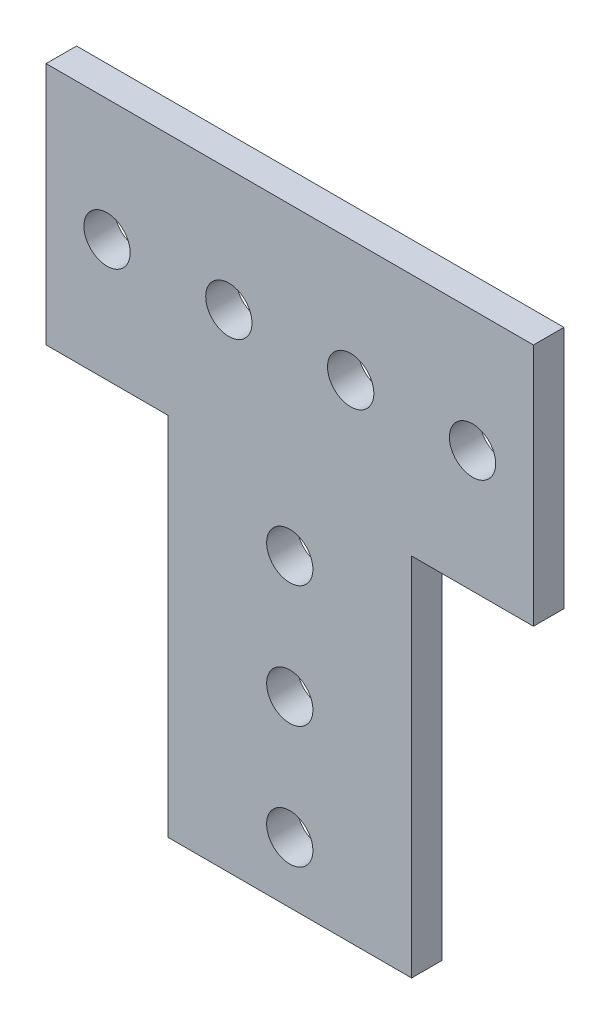
ISO-10303-21;
HEADER;
FILE_DESCRIPTION(('STEP AP214'),'2;1');
FILE_NAME('part.step','',(''),(''),'','','');
FILE_SCHEMA(('AUTOMOTIVE_DESIGN { 1 0 10303 214 1 1 1 1 }'));
ENDSEC;
DATA;
#1=APPLICATION_CONTEXT('core data for automotive mechanical design processes');
#2=APPLICATION_PROTOCOL_DEFINITION('international standard','automotive_design',2000,#1);
#3=PRODUCT_CONTEXT('',#1,'mechanical');
#4=PRODUCT('Part','Part','',(#3));
#5=PRODUCT_RELATED_PRODUCT_CATEGORY('part','',(#4));
#6=PRODUCT_DEFINITION_FORMATION('','',#4);
#7=PRODUCT_DEFINITION_CONTEXT('part definition',#1,'design');
#8=PRODUCT_DEFINITION('design','',#6,#7);
#9=PRODUCT_DEFINITION_SHAPE('','',#8);
#10=(LENGTH_UNIT() NAMED_UNIT(*) SI_UNIT(.MILLI.,.METRE.));
#11=(NAMED_UNIT(*) PLANE_ANGLE_UNIT() SI_UNIT($,.RADIAN.));
#12=(NAMED_UNIT(*) SI_UNIT($,.STERADIAN.) SOLID_ANGLE_UNIT());
#13=UNCERTAINTY_MEASURE_WITH_UNIT(LENGTH_MEASURE(1.E-05),#10,'distance_accuracy_value','');
#14=(GEOMETRIC_REPRESENTATION_CONTEXT(3) GLOBAL_UNCERTAINTY_ASSIGNED_CONTEXT((#13)) GLOBAL_UNIT_ASSIGNED_CONTEXT((#10,
#11,#12)) REPRESENTATION_CONTEXT('',''));
#15=CARTESIAN_POINT('',(0.,0.,0.));
#16=DIRECTION('',(0.,0.,1.));
#17=DIRECTION('',(1.,0.,0.));
#18=AXIS2_PLACEMENT_3D('',#15,#16,#17);
#19=CARTESIAN_POINT('',(25.4,0.,3.175));
#20=DIRECTION('',(0.,1.,0.));
#21=DIRECTION('',(-1.,0.,0.));
#22=AXIS2_PLACEMENT_3D('',#19,#20,#21);
#23=PLANE('',#22);
#24=DIRECTION('',(1.,0.,0.));
#25=VECTOR('',#24,1.);
#26=CARTESIAN_POINT('',(25.4,0.,0.));
#27=LINE('',#26,#25);
#28=CARTESIAN_POINT('',(0.,0.,0.));
#29=VERTEX_POINT('',#28);
#30=CARTESIAN_POINT('',(25.4,0.,0.));
#31=VERTEX_POINT('',#30);
#32=EDGE_CURVE('E140',#29,#31,#27,.T.);
#33=ORIENTED_EDGE('',*,*,#32,.T.);
#34=DIRECTION('',(0.,0.,-1.));
#35=VECTOR('',#34,1.);
#36=CARTESIAN_POINT('',(25.4,0.,3.175));
#37=LINE('',#36,#35);
#38=CARTESIAN_POINT('',(25.4,0.,3.175));
#39=VERTEX_POINT('',#38);
#40=EDGE_CURVE('E11',#39,#31,#37,.T.);
#41=ORIENTED_EDGE('',*,*,#40,.F.);
#42=DIRECTION('',(1.,0.,0.));
#43=VECTOR('',#42,1.);
#44=CARTESIAN_POINT('',(25.4,0.,3.175));
#45=LINE('',#44,#43);
#46=CARTESIAN_POINT('',(0.,0.,3.175));
#47=VERTEX_POINT('',#46);
#48=EDGE_CURVE('E163',#47,#39,#45,.T.);
#49=ORIENTED_EDGE('',*,*,#48,.F.);
#50=DIRECTION('',(0.,0.,-1.));
#51=VECTOR('',#50,1.);
#52=CARTESIAN_POINT('',(0.,0.,3.175));
#53=LINE('',#52,#51);
#54=EDGE_CURVE('E136',#47,#29,#53,.T.);
#55=ORIENTED_EDGE('',*,*,#54,.T.);
#56=EDGE_LOOP('',(#33,#41,#49,#55));
#57=FACE_BOUND('',#56,.T.);
#58=ADVANCED_FACE('F39',(#57),#23,.F.);
#59=CARTESIAN_POINT('',(25.4,38.1,3.175));
#60=DIRECTION('',(-1.,0.,0.));
#61=DIRECTION('',(0.,0.,1.));
#62=AXIS2_PLACEMENT_3D('',#59,#60,#61);
#63=PLANE('',#62);
#64=DIRECTION('',(0.,1.,0.));
#65=VECTOR('',#64,1.);
#66=CARTESIAN_POINT('',(25.4,38.1,0.));
#67=LINE('',#66,#65);
#68=CARTESIAN_POINT('',(25.4,38.1,0.));
#69=VERTEX_POINT('',#68);
#70=EDGE_CURVE('E144',#31,#69,#67,.T.);
#71=ORIENTED_EDGE('',*,*,#70,.T.);
#72=DIRECTION('',(0.,0.,-1.));
#73=VECTOR('',#72,1.);
#74=CARTESIAN_POINT('',(25.4,38.1,3.175));
#75=LINE('',#74,#73);
#76=CARTESIAN_POINT('',(25.4,38.1,3.175));
#77=VERTEX_POINT('',#76);
#78=EDGE_CURVE('E48',#77,#69,#75,.T.);
#79=ORIENTED_EDGE('',*,*,#78,.F.);
#80=DIRECTION('',(0.,1.,0.));
#81=VECTOR('',#80,1.);
#82=CARTESIAN_POINT('',(25.4,38.1,3.175));
#83=LINE('',#82,#81);
#84=EDGE_CURVE('E99',#39,#77,#83,.T.);
#85=ORIENTED_EDGE('',*,*,#84,.F.);
#86=ORIENTED_EDGE('',*,*,#40,.T.);
#87=EDGE_LOOP('',(#71,#79,#85,#86));
#88=FACE_BOUND('',#87,.T.);
#89=ADVANCED_FACE('F302',(#88),#63,.F.);
#90=CARTESIAN_POINT('',(38.1,38.1,3.175));
#91=DIRECTION('',(0.,1.,0.));
#92=DIRECTION('',(0.,0.,1.));
#93=AXIS2_PLACEMENT_3D('',#90,#91,#92);
#94=PLANE('',#93);
#95=DIRECTION('',(1.,0.,0.));
#96=VECTOR('',#95,1.);
#97=CARTESIAN_POINT('',(38.1,38.1,0.));
#98=LINE('',#97,#96);
#99=CARTESIAN_POINT('',(38.1,38.1,0.));
#100=VERTEX_POINT('',#99);
#101=EDGE_CURVE('E148',#69,#100,#98,.T.);
#102=ORIENTED_EDGE('',*,*,#101,.T.);
#103=DIRECTION('',(0.,0.,-1.));
#104=VECTOR('',#103,1.);
#105=CARTESIAN_POINT('',(38.1,38.1,3.175));
#106=LINE('',#105,#104);
#107=CARTESIAN_POINT('',(38.1,38.1,3.175));
#108=VERTEX_POINT('',#107);
#109=EDGE_CURVE('E174',#108,#100,#106,.T.);
#110=ORIENTED_EDGE('',*,*,#109,.F.);
#111=DIRECTION('',(1.,0.,0.));
#112=VECTOR('',#111,1.);
#113=CARTESIAN_POINT('',(38.1,38.1,3.175));
#114=LINE('',#113,#112);
#115=EDGE_CURVE('E184',#77,#108,#114,.T.);
#116=ORIENTED_EDGE('',*,*,#115,.F.);
#117=ORIENTED_EDGE('',*,*,#78,.T.);
#118=EDGE_LOOP('',(#102,#110,#116,#117));
#119=FACE_BOUND('',#118,.T.);
#120=ADVANCED_FACE('F182',(#119),#94,.F.);
#121=CARTESIAN_POINT('',(38.1,63.5,3.175));
#122=DIRECTION('',(-1.,0.,0.));
#123=DIRECTION('',(0.,0.,1.));
#124=AXIS2_PLACEMENT_3D('',#121,#122,#123);
#125=PLANE('',#124);
#126=DIRECTION('',(0.,1.,0.));
#127=VECTOR('',#126,1.);
#128=CARTESIAN_POINT('',(38.1,63.5,0.));
#129=LINE('',#128,#127);
#130=CARTESIAN_POINT('',(38.1,63.5,0.));
#131=VERTEX_POINT('',#130);
#132=EDGE_CURVE('E151',#100,#131,#129,.T.);
#133=ORIENTED_EDGE('',*,*,#132,.T.);
#134=DIRECTION('',(0.,0.,-1.));
#135=VECTOR('',#134,1.);
#136=CARTESIAN_POINT('',(38.1,63.5,3.175));
#137=LINE('',#136,#135);
#138=CARTESIAN_POINT('',(38.1,63.5,3.175));
#139=VERTEX_POINT('',#138);
#140=EDGE_CURVE('E170',#139,#131,#137,.T.);
#141=ORIENTED_EDGE('',*,*,#140,.F.);
#142=DIRECTION('',(0.,1.,0.));
#143=VECTOR('',#142,1.);
#144=CARTESIAN_POINT('',(38.1,63.5,3.175));
#145=LINE('',#144,#143);
#146=EDGE_CURVE('E197',#108,#139,#145,.T.);
#147=ORIENTED_EDGE('',*,*,#146,.F.);
#148=ORIENTED_EDGE('',*,*,#109,.T.);
#149=EDGE_LOOP('',(#133,#141,#147,#148));
#150=FACE_BOUND('',#149,.T.);
#151=ADVANCED_FACE('F192',(#150),#125,.F.);
#152=CARTESIAN_POINT('',(-12.7,63.5,3.175));
#153=DIRECTION('',(0.,-1.,0.));
#154=DIRECTION('',(0.,0.,-1.));
#155=AXIS2_PLACEMENT_3D('',#152,#153,#154);
#156=PLANE('',#155);
#157=DIRECTION('',(-1.,0.,0.));
#158=VECTOR('',#157,1.);
#159=CARTESIAN_POINT('',(-12.7,63.5,0.));
#160=LINE('',#159,#158);
#161=CARTESIAN_POINT('',(-12.7,63.5,0.));
#162=VERTEX_POINT('',#161);
#163=EDGE_CURVE('E154',#131,#162,#160,.T.);
#164=ORIENTED_EDGE('',*,*,#163,.T.);
#165=DIRECTION('',(0.,0.,-1.));
#166=VECTOR('',#165,1.);
#167=CARTESIAN_POINT('',(-12.7,63.5,3.175));
#168=LINE('',#167,#166);
#169=CARTESIAN_POINT('',(-12.7,63.5,3.175));
#170=VERTEX_POINT('',#169);
#171=EDGE_CURVE('E129',#170,#162,#168,.T.);
#172=ORIENTED_EDGE('',*,*,#171,.F.);
#173=DIRECTION('',(-1.,0.,0.));
#174=VECTOR('',#173,1.);
#175=CARTESIAN_POINT('',(-12.7,63.5,3.175));
#176=LINE('',#175,#174);
#177=EDGE_CURVE('E118',#139,#170,#176,.T.);
#178=ORIENTED_EDGE('',*,*,#177,.F.);
#179=ORIENTED_EDGE('',*,*,#140,.T.);
#180=EDGE_LOOP('',(#164,#172,#178,#179));
#181=FACE_BOUND('',#180,.T.);
#182=ADVANCED_FACE('F195',(#181),#156,.F.);
#183=CARTESIAN_POINT('',(-12.7,38.1,3.175));
#184=DIRECTION('',(1.,0.,0.));
#185=DIRECTION('',(0.,0.,-1.));
#186=AXIS2_PLACEMENT_3D('',#183,#184,#185);
#187=PLANE('',#186);
#188=DIRECTION('',(0.,-1.,0.));
#189=VECTOR('',#188,1.);
#190=CARTESIAN_POINT('',(-12.7,38.1,0.));
#191=LINE('',#190,#189);
#192=CARTESIAN_POINT('',(-12.7,38.1,0.));
#193=VERTEX_POINT('',#192);
#194=EDGE_CURVE('E127',#162,#193,#191,.T.);
#195=ORIENTED_EDGE('',*,*,#194,.T.);
#196=DIRECTION('',(0.,0.,-1.));
#197=VECTOR('',#196,1.);
#198=CARTESIAN_POINT('',(-12.7,38.1,3.175));
#199=LINE('',#198,#197);
#200=CARTESIAN_POINT('',(-12.7,38.1,3.175));
#201=VERTEX_POINT('',#200);
#202=EDGE_CURVE('E124',#201,#193,#199,.T.);
#203=ORIENTED_EDGE('',*,*,#202,.F.);
#204=DIRECTION('',(0.,-1.,0.));
#205=VECTOR('',#204,1.);
#206=CARTESIAN_POINT('',(-12.7,38.1,3.175));
#207=LINE('',#206,#205);
#208=EDGE_CURVE('E112',#170,#201,#207,.T.);
#209=ORIENTED_EDGE('',*,*,#208,.F.);
#210=ORIENTED_EDGE('',*,*,#171,.T.);
#211=EDGE_LOOP('',(#195,#203,#209,#210));
#212=FACE_BOUND('',#211,.T.);
#213=ADVANCED_FACE('F125',(#212),#187,.F.);
#214=CARTESIAN_POINT('',(0.,38.1,3.175));
#215=DIRECTION('',(0.,1.,0.));
#216=DIRECTION('',(0.,0.,1.));
#217=AXIS2_PLACEMENT_3D('',#214,#215,#216);
#218=PLANE('',#217);
#219=DIRECTION('',(1.,0.,0.));
#220=VECTOR('',#219,1.);
#221=CARTESIAN_POINT('',(0.,38.1,0.));
#222=LINE('',#221,#220);
#223=CARTESIAN_POINT('',(0.,38.1,0.));
#224=VERTEX_POINT('',#223);
#225=EDGE_CURVE('E85',#193,#224,#222,.T.);
#226=ORIENTED_EDGE('',*,*,#225,.T.);
#227=DIRECTION('',(0.,0.,-1.));
#228=VECTOR('',#227,1.);
#229=CARTESIAN_POINT('',(0.,38.1,3.175));
#230=LINE('',#229,#228);
#231=CARTESIAN_POINT('',(0.,38.1,3.175));
#232=VERTEX_POINT('',#231);
#233=EDGE_CURVE('E130',#232,#224,#230,.T.);
#234=ORIENTED_EDGE('',*,*,#233,.F.);
#235=DIRECTION('',(1.,0.,0.));
#236=VECTOR('',#235,1.);
#237=CARTESIAN_POINT('',(0.,38.1,3.175));
#238=LINE('',#237,#236);
#239=EDGE_CURVE('E116',#201,#232,#238,.T.);
#240=ORIENTED_EDGE('',*,*,#239,.F.);
#241=ORIENTED_EDGE('',*,*,#202,.T.);
#242=EDGE_LOOP('',(#226,#234,#240,#241));
#243=FACE_BOUND('',#242,.T.);
#244=ADVANCED_FACE('F132',(#243),#218,.F.);
#245=CARTESIAN_POINT('',(0.,0.,3.175));
#246=DIRECTION('',(1.,0.,0.));
#247=DIRECTION('',(0.,0.,-1.));
#248=AXIS2_PLACEMENT_3D('',#245,#246,#247);
#249=PLANE('',#248);
#250=DIRECTION('',(0.,-1.,0.));
#251=VECTOR('',#250,1.);
#252=CARTESIAN_POINT('',(0.,0.,0.));
#253=LINE('',#252,#251);
#254=EDGE_CURVE('E91',#224,#29,#253,.T.);
#255=ORIENTED_EDGE('',*,*,#254,.T.);
#256=ORIENTED_EDGE('',*,*,#54,.F.);
#257=DIRECTION('',(0.,-1.,0.));
#258=VECTOR('',#257,1.);
#259=CARTESIAN_POINT('',(0.,0.,3.175));
#260=LINE('',#259,#258);
#261=EDGE_CURVE('E56',#232,#47,#260,.T.);
#262=ORIENTED_EDGE('',*,*,#261,.F.);
#263=ORIENTED_EDGE('',*,*,#233,.T.);
#264=EDGE_LOOP('',(#255,#256,#262,#263));
#265=FACE_BOUND('',#264,.T.);
#266=ADVANCED_FACE('F309',(#265),#249,.F.);
#267=CARTESIAN_POINT('',(0.,0.,3.175));
#268=DIRECTION('',(0.,0.,-1.));
#269=DIRECTION('',(-1.,0.,0.));
#270=AXIS2_PLACEMENT_3D('',#267,#268,#269);
#271=PLANE('',#270);
#272=CARTESIAN_POINT('',(12.7,6.35,3.175));
#273=DIRECTION('',(0.,0.,-1.));
#274=DIRECTION('',(-1.,0.,0.));
#275=AXIS2_PLACEMENT_3D('',#272,#273,#274);
#276=CIRCLE('',#275,2.413);
#277=CARTESIAN_POINT('',(10.287,6.35,3.175));
#278=VERTEX_POINT('',#277);
#279=EDGE_CURVE('E251',#278,#278,#276,.T.);
#280=ORIENTED_EDGE('',*,*,#279,.T.);
#281=EDGE_LOOP('',(#280));
#282=FACE_BOUND('',#281,.T.);
#283=CARTESIAN_POINT('',(12.7,31.75,3.175));
#284=DIRECTION('',(0.,0.,-1.));
#285=DIRECTION('',(-1.,0.,0.));
#286=AXIS2_PLACEMENT_3D('',#283,#284,#285);
#287=CIRCLE('',#286,2.413);
#288=CARTESIAN_POINT('',(10.287,31.75,3.175));
#289=VERTEX_POINT('',#288);
#290=EDGE_CURVE('E243',#289,#289,#287,.T.);
#291=ORIENTED_EDGE('',*,*,#290,.T.);
#292=EDGE_LOOP('',(#291));
#293=FACE_BOUND('',#292,.T.);
#294=CARTESIAN_POINT('',(12.7,19.05,3.175));
#295=DIRECTION('',(0.,0.,-1.));
#296=DIRECTION('',(-1.,0.,0.));
#297=AXIS2_PLACEMENT_3D('',#294,#295,#296);
#298=CIRCLE('',#297,2.413);
#299=CARTESIAN_POINT('',(10.287,19.05,3.175));
#300=VERTEX_POINT('',#299);
#301=EDGE_CURVE('E220',#300,#300,#298,.T.);
#302=ORIENTED_EDGE('',*,*,#301,.T.);
#303=EDGE_LOOP('',(#302));
#304=FACE_BOUND('',#303,.T.);
#305=CARTESIAN_POINT('',(31.7499999999985,50.8000000002438,3.175));
#306=DIRECTION('',(0.,0.,-1.));
#307=DIRECTION('',(-1.,0.,0.));
#308=AXIS2_PLACEMENT_3D('',#305,#306,#307);
#309=CIRCLE('',#308,2.413);
#310=CARTESIAN_POINT('',(29.3369999999985,50.8000000002438,3.175));
#311=VERTEX_POINT('',#310);
#312=EDGE_CURVE('E219',#311,#311,#309,.T.);
#313=ORIENTED_EDGE('',*,*,#312,.T.);
#314=EDGE_LOOP('',(#313));
#315=FACE_BOUND('',#314,.T.);
#316=CARTESIAN_POINT('',(-6.35000000000149,50.8000000002438,3.175));
#317=DIRECTION('',(0.,0.,-1.));
#318=DIRECTION('',(-1.,0.,0.));
#319=AXIS2_PLACEMENT_3D('',#316,#317,#318);
#320=CIRCLE('',#319,2.413);
#321=CARTESIAN_POINT('',(-8.76300000000148,50.8000000002438,3.175));
#322=VERTEX_POINT('',#321);
#323=EDGE_CURVE('E228',#322,#322,#320,.T.);
#324=ORIENTED_EDGE('',*,*,#323,.T.);
#325=EDGE_LOOP('',(#324));
#326=FACE_BOUND('',#325,.T.);
#327=CARTESIAN_POINT('',(6.34999999999851,50.8000000002438,3.175));
#328=DIRECTION('',(0.,0.,-1.));
#329=DIRECTION('',(-1.,0.,0.));
#330=AXIS2_PLACEMENT_3D('',#327,#328,#329);
#331=CIRCLE('',#330,2.413);
#332=CARTESIAN_POINT('',(3.93699999999852,50.8000000002438,3.175));
#333=VERTEX_POINT('',#332);
#334=EDGE_CURVE('E211',#333,#333,#331,.T.);
#335=ORIENTED_EDGE('',*,*,#334,.T.);
#336=EDGE_LOOP('',(#335));
#337=FACE_BOUND('',#336,.T.);
#338=CARTESIAN_POINT('',(19.0499999999985,50.8000000002438,3.175));
#339=DIRECTION('',(0.,0.,-1.));
#340=DIRECTION('',(-1.,0.,0.));
#341=AXIS2_PLACEMENT_3D('',#338,#339,#340);
#342=CIRCLE('',#341,2.413);
#343=CARTESIAN_POINT('',(16.6369999999985,50.8000000002438,3.175));
#344=VERTEX_POINT('',#343);
#345=EDGE_CURVE('E145',#344,#344,#342,.T.);
#346=ORIENTED_EDGE('',*,*,#345,.T.);
#347=EDGE_LOOP('',(#346));
#348=FACE_BOUND('',#347,.T.);
#349=ORIENTED_EDGE('',*,*,#48,.T.);
#350=ORIENTED_EDGE('',*,*,#84,.T.);
#351=ORIENTED_EDGE('',*,*,#115,.T.);
#352=ORIENTED_EDGE('',*,*,#146,.T.);
#353=ORIENTED_EDGE('',*,*,#177,.T.);
#354=ORIENTED_EDGE('',*,*,#208,.T.);
#355=ORIENTED_EDGE('',*,*,#239,.T.);
#356=ORIENTED_EDGE('',*,*,#261,.T.);
#357=EDGE_LOOP('',(#349,#350,#351,#352,#353,#354,#355,#356));
#358=FACE_BOUND('',#357,.T.);
#359=ADVANCED_FACE('F114',(#282,#293,#304,#315,#326,#337,#348,#358),#271,.F.);
#360=CARTESIAN_POINT('',(0.,0.,0.));
#361=DIRECTION('',(0.,0.,-1.));
#362=DIRECTION('',(-1.,0.,0.));
#363=AXIS2_PLACEMENT_3D('',#360,#361,#362);
#364=PLANE('',#363);
#365=CARTESIAN_POINT('',(12.7,6.35,0.));
#366=DIRECTION('',(0.,0.,-1.));
#367=DIRECTION('',(-1.,0.,0.));
#368=AXIS2_PLACEMENT_3D('',#365,#366,#367);
#369=CIRCLE('',#368,2.413);
#370=CARTESIAN_POINT('',(10.287,6.35,0.));
#371=VERTEX_POINT('',#370);
#372=EDGE_CURVE('E247',#371,#371,#369,.T.);
#373=ORIENTED_EDGE('',*,*,#372,.F.);
#374=EDGE_LOOP('',(#373));
#375=FACE_BOUND('',#374,.T.);
#376=CARTESIAN_POINT('',(12.7,31.75,0.));
#377=DIRECTION('',(0.,0.,-1.));
#378=DIRECTION('',(-1.,0.,0.));
#379=AXIS2_PLACEMENT_3D('',#376,#377,#378);
#380=CIRCLE('',#379,2.413);
#381=CARTESIAN_POINT('',(10.287,31.75,0.));
#382=VERTEX_POINT('',#381);
#383=EDGE_CURVE('E255',#382,#382,#380,.T.);
#384=ORIENTED_EDGE('',*,*,#383,.F.);
#385=EDGE_LOOP('',(#384));
#386=FACE_BOUND('',#385,.T.);
#387=CARTESIAN_POINT('',(12.7,19.05,0.));
#388=DIRECTION('',(0.,0.,-1.));
#389=DIRECTION('',(-1.,0.,0.));
#390=AXIS2_PLACEMENT_3D('',#387,#388,#389);
#391=CIRCLE('',#390,2.413);
#392=CARTESIAN_POINT('',(10.287,19.05,0.));
#393=VERTEX_POINT('',#392);
#394=EDGE_CURVE('E239',#393,#393,#391,.T.);
#395=ORIENTED_EDGE('',*,*,#394,.F.);
#396=EDGE_LOOP('',(#395));
#397=FACE_BOUND('',#396,.T.);
#398=CARTESIAN_POINT('',(31.7499999999985,50.8000000002438,0.));
#399=DIRECTION('',(0.,0.,-1.));
#400=DIRECTION('',(-1.,0.,0.));
#401=AXIS2_PLACEMENT_3D('',#398,#399,#400);
#402=CIRCLE('',#401,2.413);
#403=CARTESIAN_POINT('',(29.3369999999985,50.8000000002438,0.));
#404=VERTEX_POINT('',#403);
#405=EDGE_CURVE('E215',#404,#404,#402,.T.);
#406=ORIENTED_EDGE('',*,*,#405,.F.);
#407=EDGE_LOOP('',(#406));
#408=FACE_BOUND('',#407,.T.);
#409=CARTESIAN_POINT('',(-6.35000000000149,50.8000000002438,0.));
#410=DIRECTION('',(0.,0.,-1.));
#411=DIRECTION('',(-1.,0.,0.));
#412=AXIS2_PLACEMENT_3D('',#409,#410,#411);
#413=CIRCLE('',#412,2.413);
#414=CARTESIAN_POINT('',(-8.76300000000148,50.8000000002438,0.));
#415=VERTEX_POINT('',#414);
#416=EDGE_CURVE('E224',#415,#415,#413,.T.);
#417=ORIENTED_EDGE('',*,*,#416,.F.);
#418=EDGE_LOOP('',(#417));
#419=FACE_BOUND('',#418,.T.);
#420=CARTESIAN_POINT('',(6.34999999999851,50.8000000002438,0.));
#421=DIRECTION('',(0.,0.,-1.));
#422=DIRECTION('',(-1.,0.,0.));
#423=AXIS2_PLACEMENT_3D('',#420,#421,#422);
#424=CIRCLE('',#423,2.413);
#425=CARTESIAN_POINT('',(3.93699999999852,50.8000000002438,0.));
#426=VERTEX_POINT('',#425);
#427=EDGE_CURVE('E232',#426,#426,#424,.T.);
#428=ORIENTED_EDGE('',*,*,#427,.F.);
#429=EDGE_LOOP('',(#428));
#430=FACE_BOUND('',#429,.T.);
#431=CARTESIAN_POINT('',(19.0499999999985,50.8000000002438,0.));
#432=DIRECTION('',(0.,0.,-1.));
#433=DIRECTION('',(-1.,0.,0.));
#434=AXIS2_PLACEMENT_3D('',#431,#432,#433);
#435=CIRCLE('',#434,2.413);
#436=CARTESIAN_POINT('',(16.6369999999985,50.8000000002438,0.));
#437=VERTEX_POINT('',#436);
#438=EDGE_CURVE('E207',#437,#437,#435,.T.);
#439=ORIENTED_EDGE('',*,*,#438,.F.);
#440=EDGE_LOOP('',(#439));
#441=FACE_BOUND('',#440,.T.);
#442=ORIENTED_EDGE('',*,*,#32,.F.);
#443=ORIENTED_EDGE('',*,*,#254,.F.);
#444=ORIENTED_EDGE('',*,*,#225,.F.);
#445=ORIENTED_EDGE('',*,*,#194,.F.);
#446=ORIENTED_EDGE('',*,*,#163,.F.);
#447=ORIENTED_EDGE('',*,*,#132,.F.);
#448=ORIENTED_EDGE('',*,*,#101,.F.);
#449=ORIENTED_EDGE('',*,*,#70,.F.);
#450=EDGE_LOOP('',(#442,#443,#444,#445,#446,#447,#448,#449));
#451=FACE_BOUND('',#450,.T.);
#452=ADVANCED_FACE('F188',(#375,#386,#397,#408,#419,#430,#441,#451),#364,.T.);
#453=CARTESIAN_POINT('',(19.0499999999985,50.8000000002438,3.175));
#454=DIRECTION('',(0.,0.,-1.));
#455=DIRECTION('',(-1.,0.,0.));
#456=AXIS2_PLACEMENT_3D('',#453,#454,#455);
#457=CYLINDRICAL_SURFACE('',#456,2.413);
#458=ORIENTED_EDGE('',*,*,#345,.F.);
#459=EDGE_LOOP('',(#458));
#460=FACE_BOUND('',#459,.T.);
#461=ORIENTED_EDGE('',*,*,#438,.T.);
#462=EDGE_LOOP('',(#461));
#463=FACE_BOUND('',#462,.T.);
#464=ADVANCED_FACE('F275',(#460,#463),#457,.F.);
#465=CARTESIAN_POINT('',(6.34999999999851,50.8000000002438,3.175));
#466=DIRECTION('',(0.,0.,-1.));
#467=DIRECTION('',(-1.,0.,0.));
#468=AXIS2_PLACEMENT_3D('',#465,#466,#467);
#469=CYLINDRICAL_SURFACE('',#468,2.413);
#470=ORIENTED_EDGE('',*,*,#334,.F.);
#471=EDGE_LOOP('',(#470));
#472=FACE_BOUND('',#471,.T.);
#473=ORIENTED_EDGE('',*,*,#427,.T.);
#474=EDGE_LOOP('',(#473));
#475=FACE_BOUND('',#474,.T.);
#476=ADVANCED_FACE('F289',(#472,#475),#469,.F.);
#477=CARTESIAN_POINT('',(-6.35000000000149,50.8000000002438,3.175));
#478=DIRECTION('',(0.,0.,-1.));
#479=DIRECTION('',(-1.,0.,0.));
#480=AXIS2_PLACEMENT_3D('',#477,#478,#479);
#481=CYLINDRICAL_SURFACE('',#480,2.413);
#482=ORIENTED_EDGE('',*,*,#323,.F.);
#483=EDGE_LOOP('',(#482));
#484=FACE_BOUND('',#483,.T.);
#485=ORIENTED_EDGE('',*,*,#416,.T.);
#486=EDGE_LOOP('',(#485));
#487=FACE_BOUND('',#486,.T.);
#488=ADVANCED_FACE('F295',(#484,#487),#481,.F.);
#489=CARTESIAN_POINT('',(31.7499999999985,50.8000000002438,3.175));
#490=DIRECTION('',(0.,0.,-1.));
#491=DIRECTION('',(-1.,0.,0.));
#492=AXIS2_PLACEMENT_3D('',#489,#490,#491);
#493=CYLINDRICAL_SURFACE('',#492,2.413);
#494=ORIENTED_EDGE('',*,*,#312,.F.);
#495=EDGE_LOOP('',(#494));
#496=FACE_BOUND('',#495,.T.);
#497=ORIENTED_EDGE('',*,*,#405,.T.);
#498=EDGE_LOOP('',(#497));
#499=FACE_BOUND('',#498,.T.);
#500=ADVANCED_FACE('F371',(#496,#499),#493,.F.);
#501=CARTESIAN_POINT('',(12.7,19.05,3.175));
#502=DIRECTION('',(0.,0.,-1.));
#503=DIRECTION('',(-1.,0.,0.));
#504=AXIS2_PLACEMENT_3D('',#501,#502,#503);
#505=CYLINDRICAL_SURFACE('',#504,2.413);
#506=ORIENTED_EDGE('',*,*,#301,.F.);
#507=EDGE_LOOP('',(#506));
#508=FACE_BOUND('',#507,.T.);
#509=ORIENTED_EDGE('',*,*,#394,.T.);
#510=EDGE_LOOP('',(#509));
#511=FACE_BOUND('',#510,.T.);
#512=ADVANCED_FACE('F269',(#508,#511),#505,.F.);
#513=CARTESIAN_POINT('',(12.7,31.75,3.175));
#514=DIRECTION('',(0.,0.,-1.));
#515=DIRECTION('',(-1.,0.,0.));
#516=AXIS2_PLACEMENT_3D('',#513,#514,#515);
#517=CYLINDRICAL_SURFACE('',#516,2.413);
#518=ORIENTED_EDGE('',*,*,#290,.F.);
#519=EDGE_LOOP('',(#518));
#520=FACE_BOUND('',#519,.T.);
#521=ORIENTED_EDGE('',*,*,#383,.T.);
#522=EDGE_LOOP('',(#521));
#523=FACE_BOUND('',#522,.T.);
#524=ADVANCED_FACE('F265',(#520,#523),#517,.F.);
#525=CARTESIAN_POINT('',(12.7,6.35,3.175));
#526=DIRECTION('',(0.,0.,-1.));
#527=DIRECTION('',(-1.,0.,0.));
#528=AXIS2_PLACEMENT_3D('',#525,#526,#527);
#529=CYLINDRICAL_SURFACE('',#528,2.413);
#530=ORIENTED_EDGE('',*,*,#279,.F.);
#531=EDGE_LOOP('',(#530));
#532=FACE_BOUND('',#531,.T.);
#533=ORIENTED_EDGE('',*,*,#372,.T.);
#534=EDGE_LOOP('',(#533));
#535=FACE_BOUND('',#534,.T.);
#536=ADVANCED_FACE('F268',(#532,#535),#529,.F.);
#537=CLOSED_SHELL('',(#58,#89,#120,#151,#182,#213,#244,#266,#359,#452,#464,#476,#488,#500,#512,
#524,#536));
#538=MANIFOLD_SOLID_BREP('B2',#537);
#539=ADVANCED_BREP_SHAPE_REPRESENTATION('',(#18,#538),#14);
#540=SHAPE_DEFINITION_REPRESENTATION(#9,#539);
ENDSEC;
END-ISO-10303-21;
